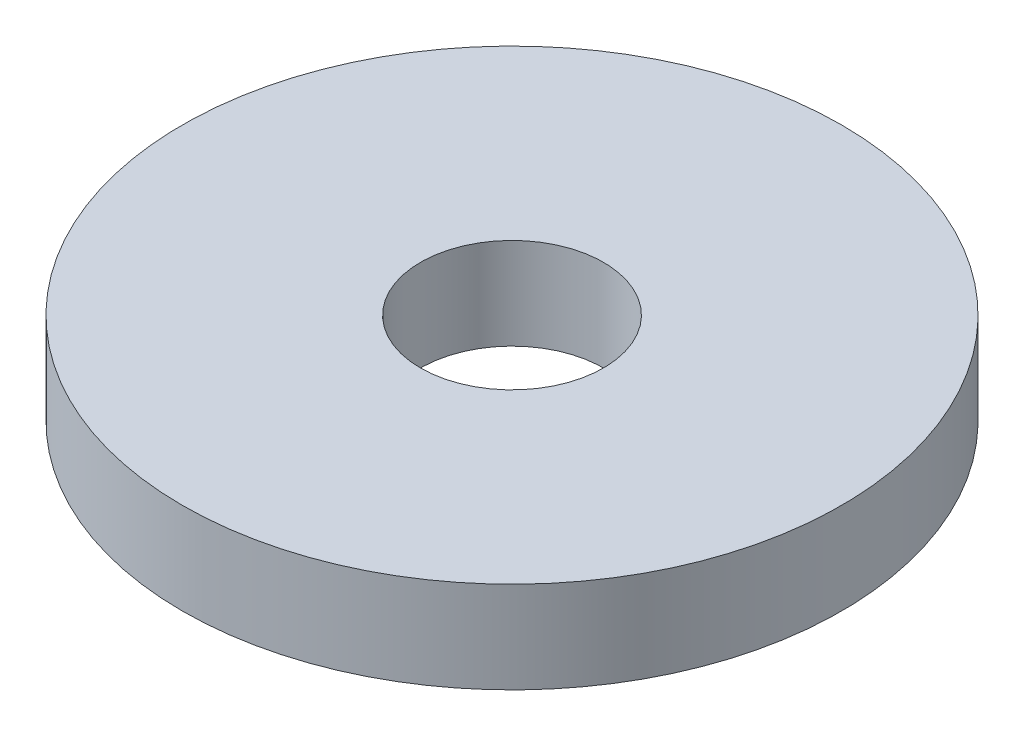
ISO-10303-21;
HEADER;
FILE_DESCRIPTION(('STEP AP214'),'2;1');
FILE_NAME('part.step','',(''),(''),'','','');
FILE_SCHEMA(('AUTOMOTIVE_DESIGN { 1 0 10303 214 1 1 1 1 }'));
ENDSEC;
DATA;
#1=APPLICATION_CONTEXT('core data for automotive mechanical design processes');
#2=APPLICATION_PROTOCOL_DEFINITION('international standard','automotive_design',2000,#1);
#3=PRODUCT_CONTEXT('',#1,'mechanical');
#4=PRODUCT('Part','Part','',(#3));
#5=PRODUCT_RELATED_PRODUCT_CATEGORY('part','',(#4));
#6=PRODUCT_DEFINITION_FORMATION('','',#4);
#7=PRODUCT_DEFINITION_CONTEXT('part definition',#1,'design');
#8=PRODUCT_DEFINITION('design','',#6,#7);
#9=PRODUCT_DEFINITION_SHAPE('','',#8);
#10=(LENGTH_UNIT() NAMED_UNIT(*) SI_UNIT(.MILLI.,.METRE.));
#11=(NAMED_UNIT(*) PLANE_ANGLE_UNIT() SI_UNIT($,.RADIAN.));
#12=(NAMED_UNIT(*) SI_UNIT($,.STERADIAN.) SOLID_ANGLE_UNIT());
#13=UNCERTAINTY_MEASURE_WITH_UNIT(LENGTH_MEASURE(1.E-05),#10,'distance_accuracy_value','');
#14=(GEOMETRIC_REPRESENTATION_CONTEXT(3) GLOBAL_UNCERTAINTY_ASSIGNED_CONTEXT((#13)) GLOBAL_UNIT_ASSIGNED_CONTEXT((#10,
#11,#12)) REPRESENTATION_CONTEXT('',''));
#15=CARTESIAN_POINT('',(0.,0.,0.));
#16=DIRECTION('',(0.,0.,1.));
#17=DIRECTION('',(1.,0.,0.));
#18=AXIS2_PLACEMENT_3D('',#15,#16,#17);
#19=CARTESIAN_POINT('',(0.,3.175,0.));
#20=DIRECTION('',(0.,1.,0.));
#21=DIRECTION('',(0.,0.,1.));
#22=AXIS2_PLACEMENT_3D('',#19,#20,#21);
#23=PLANE('',#22);
#24=CARTESIAN_POINT('',(0.,3.175,0.));
#25=DIRECTION('',(0.,1.,0.));
#26=DIRECTION('',(0.,0.,1.));
#27=AXIS2_PLACEMENT_3D('',#24,#25,#26);
#28=CIRCLE('',#27,11.43);
#29=CARTESIAN_POINT('',(0.,3.175,11.43));
#30=VERTEX_POINT('',#29);
#31=EDGE_CURVE('E10',#30,#30,#28,.T.);
#32=ORIENTED_EDGE('',*,*,#31,.T.);
#33=EDGE_LOOP('',(#32));
#34=FACE_BOUND('',#33,.T.);
#35=CARTESIAN_POINT('',(0.,3.175,0.));
#36=DIRECTION('',(0.,1.,0.));
#37=DIRECTION('',(0.,0.,1.));
#38=AXIS2_PLACEMENT_3D('',#35,#36,#37);
#39=CIRCLE('',#38,3.175);
#40=CARTESIAN_POINT('',(0.,3.175,3.175));
#41=VERTEX_POINT('',#40);
#42=EDGE_CURVE('E42',#41,#41,#39,.T.);
#43=ORIENTED_EDGE('',*,*,#42,.F.);
#44=EDGE_LOOP('',(#43));
#45=FACE_BOUND('',#44,.T.);
#46=ADVANCED_FACE('F31',(#34,#45),#23,.T.);
#47=CARTESIAN_POINT('',(0.,0.,0.));
#48=DIRECTION('',(0.,1.,0.));
#49=DIRECTION('',(0.,0.,1.));
#50=AXIS2_PLACEMENT_3D('',#47,#48,#49);
#51=PLANE('',#50);
#52=CARTESIAN_POINT('',(0.,0.,0.));
#53=DIRECTION('',(0.,1.,0.));
#54=DIRECTION('',(0.,0.,1.));
#55=AXIS2_PLACEMENT_3D('',#52,#53,#54);
#56=CIRCLE('',#55,11.43);
#57=CARTESIAN_POINT('',(0.,0.,11.43));
#58=VERTEX_POINT('',#57);
#59=EDGE_CURVE('E35',#58,#58,#56,.T.);
#60=ORIENTED_EDGE('',*,*,#59,.F.);
#61=EDGE_LOOP('',(#60));
#62=FACE_BOUND('',#61,.T.);
#63=CARTESIAN_POINT('',(0.,0.,0.));
#64=DIRECTION('',(0.,1.,0.));
#65=DIRECTION('',(0.,0.,1.));
#66=AXIS2_PLACEMENT_3D('',#63,#64,#65);
#67=CIRCLE('',#66,3.175);
#68=CARTESIAN_POINT('',(0.,0.,3.175));
#69=VERTEX_POINT('',#68);
#70=EDGE_CURVE('E44',#69,#69,#67,.T.);
#71=ORIENTED_EDGE('',*,*,#70,.T.);
#72=EDGE_LOOP('',(#71));
#73=FACE_BOUND('',#72,.T.);
#74=ADVANCED_FACE('F54',(#62,#73),#51,.F.);
#75=CARTESIAN_POINT('',(0.,3.175,0.));
#76=DIRECTION('',(0.,-1.,0.));
#77=DIRECTION('',(0.,0.,-1.));
#78=AXIS2_PLACEMENT_3D('',#75,#76,#77);
#79=CYLINDRICAL_SURFACE('',#78,11.43);
#80=ORIENTED_EDGE('',*,*,#31,.F.);
#81=EDGE_LOOP('',(#80));
#82=FACE_BOUND('',#81,.T.);
#83=ORIENTED_EDGE('',*,*,#59,.T.);
#84=EDGE_LOOP('',(#83));
#85=FACE_BOUND('',#84,.T.);
#86=ADVANCED_FACE('F33',(#82,#85),#79,.T.);
#87=CARTESIAN_POINT('',(0.,3.175,0.));
#88=DIRECTION('',(0.,-1.,0.));
#89=DIRECTION('',(0.,0.,-1.));
#90=AXIS2_PLACEMENT_3D('',#87,#88,#89);
#91=CYLINDRICAL_SURFACE('',#90,3.175);
#92=ORIENTED_EDGE('',*,*,#42,.T.);
#93=EDGE_LOOP('',(#92));
#94=FACE_BOUND('',#93,.T.);
#95=ORIENTED_EDGE('',*,*,#70,.F.);
#96=EDGE_LOOP('',(#95));
#97=FACE_BOUND('',#96,.T.);
#98=ADVANCED_FACE('F50',(#94,#97),#91,.F.);
#99=CLOSED_SHELL('',(#46,#74,#86,#98));
#100=MANIFOLD_SOLID_BREP('B2',#99);
#101=ADVANCED_BREP_SHAPE_REPRESENTATION('',(#18,#100),#14);
#102=SHAPE_DEFINITION_REPRESENTATION(#9,#101);
ENDSEC;
END-ISO-10303-21;
